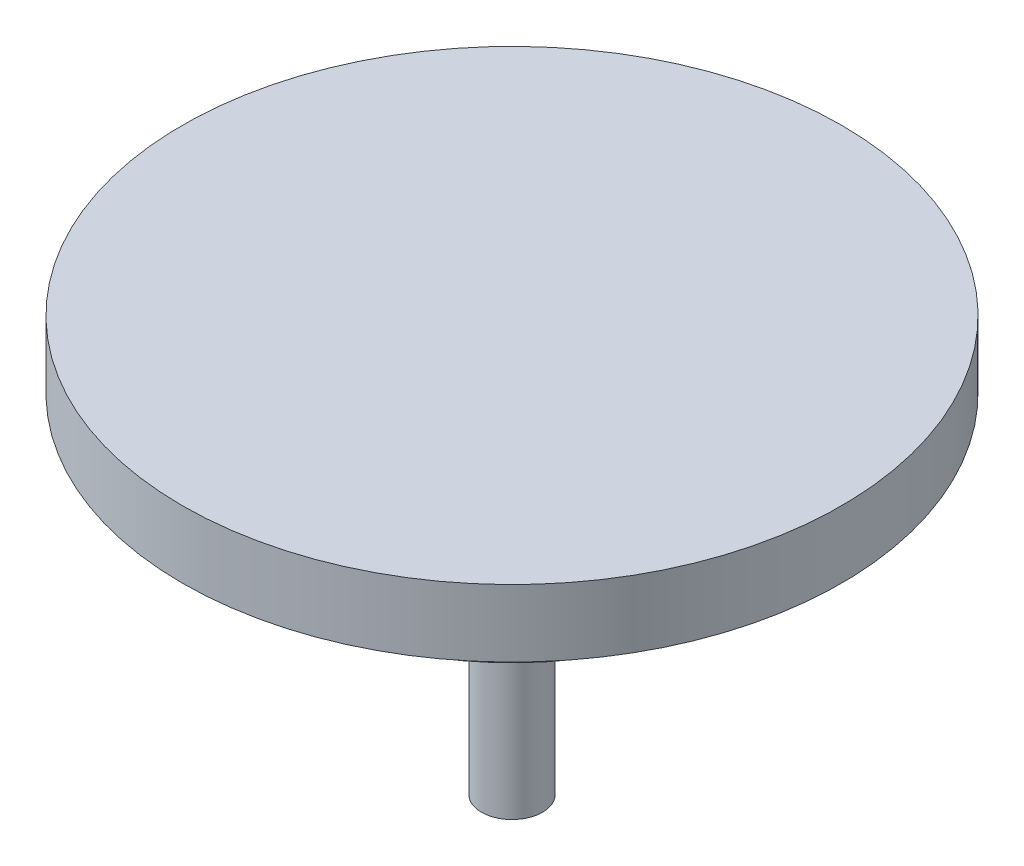
ISO-10303-21;
HEADER;
FILE_DESCRIPTION(('STEP AP214'),'2;1');
FILE_NAME('part.step','',(''),(''),'','','');
FILE_SCHEMA(('AUTOMOTIVE_DESIGN { 1 0 10303 214 1 1 1 1 }'));
ENDSEC;
DATA;
#1=APPLICATION_CONTEXT('core data for automotive mechanical design processes');
#2=APPLICATION_PROTOCOL_DEFINITION('international standard','automotive_design',2000,#1);
#3=PRODUCT_CONTEXT('',#1,'mechanical');
#4=PRODUCT('Part','Part','',(#3));
#5=PRODUCT_RELATED_PRODUCT_CATEGORY('part','',(#4));
#6=PRODUCT_DEFINITION_FORMATION('','',#4);
#7=PRODUCT_DEFINITION_CONTEXT('part definition',#1,'design');
#8=PRODUCT_DEFINITION('design','',#6,#7);
#9=PRODUCT_DEFINITION_SHAPE('','',#8);
#10=(LENGTH_UNIT() NAMED_UNIT(*) SI_UNIT(.MILLI.,.METRE.));
#11=(NAMED_UNIT(*) PLANE_ANGLE_UNIT() SI_UNIT($,.RADIAN.));
#12=(NAMED_UNIT(*) SI_UNIT($,.STERADIAN.) SOLID_ANGLE_UNIT());
#13=UNCERTAINTY_MEASURE_WITH_UNIT(LENGTH_MEASURE(1.E-05),#10,'distance_accuracy_value','');
#14=(GEOMETRIC_REPRESENTATION_CONTEXT(3) GLOBAL_UNCERTAINTY_ASSIGNED_CONTEXT((#13)) GLOBAL_UNIT_ASSIGNED_CONTEXT((#10,
#11,#12)) REPRESENTATION_CONTEXT('',''));
#15=CARTESIAN_POINT('',(0.,0.,0.));
#16=DIRECTION('',(0.,0.,1.));
#17=DIRECTION('',(1.,0.,0.));
#18=AXIS2_PLACEMENT_3D('',#15,#16,#17);
#19=CARTESIAN_POINT('',(0.,11.,0.));
#20=DIRECTION('',(0.,-1.,0.));
#21=DIRECTION('',(0.,0.,-1.));
#22=AXIS2_PLACEMENT_3D('',#19,#20,#21);
#23=CYLINDRICAL_SURFACE('',#22,54.);
#24=CARTESIAN_POINT('',(0.,11.,0.));
#25=DIRECTION('',(0.,1.,0.));
#26=DIRECTION('',(0.,0.,1.));
#27=AXIS2_PLACEMENT_3D('',#24,#25,#26);
#28=CIRCLE('',#27,54.);
#29=CARTESIAN_POINT('',(0.,11.,54.));
#30=VERTEX_POINT('',#29);
#31=EDGE_CURVE('E87',#30,#30,#28,.T.);
#32=ORIENTED_EDGE('',*,*,#31,.F.);
#33=EDGE_LOOP('',(#32));
#34=FACE_BOUND('',#33,.T.);
#35=CARTESIAN_POINT('',(0.,0.,0.));
#36=DIRECTION('',(0.,1.,0.));
#37=DIRECTION('',(0.,0.,1.));
#38=AXIS2_PLACEMENT_3D('',#35,#36,#37);
#39=CIRCLE('',#38,54.);
#40=CARTESIAN_POINT('',(0.,0.,54.));
#41=VERTEX_POINT('',#40);
#42=EDGE_CURVE('E86',#41,#41,#39,.T.);
#43=ORIENTED_EDGE('',*,*,#42,.T.);
#44=EDGE_LOOP('',(#43));
#45=FACE_BOUND('',#44,.T.);
#46=ADVANCED_FACE('F36',(#34,#45),#23,.T.);
#47=CARTESIAN_POINT('',(0.,11.,0.));
#48=DIRECTION('',(0.,1.,0.));
#49=DIRECTION('',(0.,0.,1.));
#50=AXIS2_PLACEMENT_3D('',#47,#48,#49);
#51=PLANE('',#50);
#52=ORIENTED_EDGE('',*,*,#31,.T.);
#53=EDGE_LOOP('',(#52));
#54=FACE_BOUND('',#53,.T.);
#55=ADVANCED_FACE('F108',(#54),#51,.T.);
#56=CARTESIAN_POINT('',(0.,0.,0.));
#57=DIRECTION('',(0.,1.,0.));
#58=DIRECTION('',(0.,0.,1.));
#59=AXIS2_PLACEMENT_3D('',#56,#57,#58);
#60=PLANE('',#59);
#61=CARTESIAN_POINT('',(0.,0.,40.));
#62=CARTESIAN_POINT('',(-4.35909107766324,0.,1.63568879354926));
#63=CARTESIAN_POINT('',(-28.5657137141714,0.,-28.));
#64=B_SPLINE_CURVE_WITH_KNOTS('',2,(#61,#62,#63),.UNSPECIFIED.,.F.,.F.,(3,3),(0.,1.),.UNSPECIFIED.);
#65=CARTESIAN_POINT('',(0.,0.,40.));
#66=VERTEX_POINT('',#65);
#67=CARTESIAN_POINT('',(-28.5657137141714,0.,-28.));
#68=VERTEX_POINT('',#67);
#69=EDGE_CURVE('E64',#66,#68,#64,.T.);
#70=ORIENTED_EDGE('',*,*,#69,.F.);
#71=CARTESIAN_POINT('',(0.,0.,0.));
#72=DIRECTION('',(0.,-1.,0.));
#73=DIRECTION('',(0.,0.,-1.));
#74=AXIS2_PLACEMENT_3D('',#71,#72,#73);
#75=CIRCLE('',#74,40.);
#76=EDGE_CURVE('E51',#68,#66,#75,.T.);
#77=ORIENTED_EDGE('',*,*,#76,.F.);
#78=EDGE_LOOP('',(#70,#77));
#79=FACE_BOUND('',#78,.T.);
#80=CARTESIAN_POINT('',(-46.,0.,19.));
#81=DIRECTION('',(0.,1.,0.));
#82=DIRECTION('',(0.,0.,1.));
#83=AXIS2_PLACEMENT_3D('',#80,#81,#82);
#84=CIRCLE('',#83,4.);
#85=CARTESIAN_POINT('',(-46.,0.,23.));
#86=VERTEX_POINT('',#85);
#87=EDGE_CURVE('E11',#86,#86,#84,.F.);
#88=ORIENTED_EDGE('',*,*,#87,.F.);
#89=EDGE_LOOP('',(#88));
#90=FACE_BOUND('',#89,.T.);
#91=ORIENTED_EDGE('',*,*,#42,.F.);
#92=EDGE_LOOP('',(#91));
#93=FACE_BOUND('',#92,.T.);
#94=ADVANCED_FACE('F65',(#79,#90,#93),#60,.F.);
#95=CARTESIAN_POINT('',(-46.,-10.,19.));
#96=DIRECTION('',(0.,1.,0.));
#97=DIRECTION('',(0.,0.,1.));
#98=AXIS2_PLACEMENT_3D('',#95,#96,#97);
#99=CYLINDRICAL_SURFACE('',#98,4.);
#100=CARTESIAN_POINT('',(-46.,-10.,19.));
#101=DIRECTION('',(0.,-1.,0.));
#102=DIRECTION('',(0.,0.,-1.));
#103=AXIS2_PLACEMENT_3D('',#100,#101,#102);
#104=CIRCLE('',#103,4.);
#105=CARTESIAN_POINT('',(-46.,-10.,15.));
#106=VERTEX_POINT('',#105);
#107=EDGE_CURVE('E83',#106,#106,#104,.T.);
#108=ORIENTED_EDGE('',*,*,#107,.F.);
#109=EDGE_LOOP('',(#108));
#110=FACE_BOUND('',#109,.T.);
#111=ORIENTED_EDGE('',*,*,#87,.T.);
#112=EDGE_LOOP('',(#111));
#113=FACE_BOUND('',#112,.T.);
#114=ADVANCED_FACE('F119',(#110,#113),#99,.T.);
#115=CARTESIAN_POINT('',(-46.,-10.,19.));
#116=DIRECTION('',(0.,-1.,0.));
#117=DIRECTION('',(0.,0.,-1.));
#118=AXIS2_PLACEMENT_3D('',#115,#116,#117);
#119=PLANE('',#118);
#120=ORIENTED_EDGE('',*,*,#107,.T.);
#121=EDGE_LOOP('',(#120));
#122=FACE_BOUND('',#121,.T.);
#123=ADVANCED_FACE('F123',(#122),#119,.T.);
#124=CARTESIAN_POINT('',(0.,-10.,40.));
#125=CARTESIAN_POINT('',(-4.35909107766324,-10.,1.63568879354926));
#126=CARTESIAN_POINT('',(-28.5657137141714,-10.,-28.));
#127=B_SPLINE_CURVE_WITH_KNOTS('',2,(#124,#125,#126),.UNSPECIFIED.,.F.,.F.,(3,3),(0.,1.),.UNSPECIFIED.);
#128=DIRECTION('',(0.,1.,0.));
#129=VECTOR('',#128,1.);
#130=SURFACE_OF_LINEAR_EXTRUSION('',#127,#129);
#131=ORIENTED_EDGE('',*,*,#69,.T.);
#132=DIRECTION('',(0.,1.,0.));
#133=VECTOR('',#132,1.);
#134=CARTESIAN_POINT('',(-28.5657137141714,-10.,-28.));
#135=LINE('',#134,#133);
#136=CARTESIAN_POINT('',(-28.5657137141714,-10.,-28.));
#137=VERTEX_POINT('',#136);
#138=EDGE_CURVE('E75',#137,#68,#135,.T.);
#139=ORIENTED_EDGE('',*,*,#138,.F.);
#140=CARTESIAN_POINT('',(0.,-10.,40.));
#141=VERTEX_POINT('',#140);
#142=EDGE_CURVE('E76',#141,#137,#127,.T.);
#143=ORIENTED_EDGE('',*,*,#142,.F.);
#144=DIRECTION('',(0.,1.,0.));
#145=VECTOR('',#144,1.);
#146=CARTESIAN_POINT('',(0.,-10.,40.));
#147=LINE('',#146,#145);
#148=EDGE_CURVE('E73',#141,#66,#147,.T.);
#149=ORIENTED_EDGE('',*,*,#148,.T.);
#150=EDGE_LOOP('',(#131,#139,#143,#149));
#151=FACE_BOUND('',#150,.T.);
#152=ADVANCED_FACE('F78',(#151),#130,.F.);
#153=CARTESIAN_POINT('',(0.,-10.,0.));
#154=DIRECTION('',(0.,1.,0.));
#155=DIRECTION('',(0.,0.,1.));
#156=AXIS2_PLACEMENT_3D('',#153,#154,#155);
#157=CYLINDRICAL_SURFACE('',#156,40.);
#158=ORIENTED_EDGE('',*,*,#76,.T.);
#159=ORIENTED_EDGE('',*,*,#148,.F.);
#160=CARTESIAN_POINT('',(0.,-10.,0.));
#161=DIRECTION('',(0.,-1.,0.));
#162=DIRECTION('',(0.,0.,-1.));
#163=AXIS2_PLACEMENT_3D('',#160,#161,#162);
#164=CIRCLE('',#163,40.);
#165=EDGE_CURVE('E59',#137,#141,#164,.T.);
#166=ORIENTED_EDGE('',*,*,#165,.F.);
#167=ORIENTED_EDGE('',*,*,#138,.T.);
#168=EDGE_LOOP('',(#158,#159,#166,#167));
#169=FACE_BOUND('',#168,.T.);
#170=ADVANCED_FACE('F72',(#169),#157,.T.);
#171=CARTESIAN_POINT('',(-9.32097396737447,-10.,3.81784439677463));
#172=DIRECTION('',(0.,1.,0.));
#173=DIRECTION('',(0.,0.,1.));
#174=AXIS2_PLACEMENT_3D('',#171,#172,#173);
#175=PLANE('',#174);
#176=CARTESIAN_POINT('',(0.,-10.,0.));
#177=DIRECTION('',(0.,1.,0.));
#178=DIRECTION('',(0.,0.,1.));
#179=AXIS2_PLACEMENT_3D('',#176,#177,#178);
#180=CIRCLE('',#179,5.);
#181=CARTESIAN_POINT('',(0.,-10.,5.));
#182=VERTEX_POINT('',#181);
#183=EDGE_CURVE('E40',#182,#182,#180,.F.);
#184=ORIENTED_EDGE('',*,*,#183,.F.);
#185=EDGE_LOOP('',(#184));
#186=FACE_BOUND('',#185,.T.);
#187=ORIENTED_EDGE('',*,*,#142,.T.);
#188=ORIENTED_EDGE('',*,*,#165,.T.);
#189=EDGE_LOOP('',(#187,#188));
#190=FACE_BOUND('',#189,.T.);
#191=ADVANCED_FACE('F99',(#186,#190),#175,.F.);
#192=CARTESIAN_POINT('',(0.,-57.,0.));
#193=DIRECTION('',(0.,1.,0.));
#194=DIRECTION('',(0.,0.,1.));
#195=AXIS2_PLACEMENT_3D('',#192,#193,#194);
#196=PLANE('',#195);
#197=CARTESIAN_POINT('',(0.,-57.,0.));
#198=DIRECTION('',(0.,1.,0.));
#199=DIRECTION('',(0.,0.,1.));
#200=AXIS2_PLACEMENT_3D('',#197,#198,#199);
#201=CIRCLE('',#200,5.);
#202=CARTESIAN_POINT('',(0.,-57.,5.));
#203=VERTEX_POINT('',#202);
#204=EDGE_CURVE('E45',#203,#203,#201,.T.);
#205=ORIENTED_EDGE('',*,*,#204,.F.);
#206=EDGE_LOOP('',(#205));
#207=FACE_BOUND('',#206,.T.);
#208=ADVANCED_FACE('F97',(#207),#196,.F.);
#209=CARTESIAN_POINT('',(0.,-57.,0.));
#210=DIRECTION('',(0.,1.,0.));
#211=DIRECTION('',(0.,0.,1.));
#212=AXIS2_PLACEMENT_3D('',#209,#210,#211);
#213=CYLINDRICAL_SURFACE('',#212,5.);
#214=CARTESIAN_POINT('',(0.,-57.,5.));
#215=CARTESIAN_POINT('',(0.,-56.5104166666667,5.));
#216=CARTESIAN_POINT('',(0.,-56.0208333333333,5.));
#217=CARTESIAN_POINT('',(0.,-55.0416666666667,5.));
#218=CARTESIAN_POINT('',(0.,-54.5520833333333,5.));
#219=CARTESIAN_POINT('',(0.,-53.5729166666667,5.));
#220=CARTESIAN_POINT('',(0.,-53.0833333333333,5.));
#221=CARTESIAN_POINT('',(0.,-52.1041666666667,5.));
#222=CARTESIAN_POINT('',(0.,-51.6145833333333,5.));
#223=CARTESIAN_POINT('',(0.,-50.6354166666667,5.));
#224=CARTESIAN_POINT('',(0.,-50.1458333333333,5.));
#225=CARTESIAN_POINT('',(0.,-49.1666666666667,5.));
#226=CARTESIAN_POINT('',(0.,-48.6770833333333,5.));
#227=CARTESIAN_POINT('',(0.,-47.6979166666667,5.));
#228=CARTESIAN_POINT('',(0.,-47.2083333333333,5.));
#229=CARTESIAN_POINT('',(0.,-46.2291666666667,5.));
#230=CARTESIAN_POINT('',(0.,-45.7395833333333,5.));
#231=CARTESIAN_POINT('',(0.,-44.7604166666667,5.));
#232=CARTESIAN_POINT('',(0.,-44.2708333333333,5.));
#233=CARTESIAN_POINT('',(0.,-43.2916666666667,5.));
#234=CARTESIAN_POINT('',(0.,-42.8020833333333,5.));
#235=CARTESIAN_POINT('',(0.,-41.8229166666667,5.));
#236=CARTESIAN_POINT('',(0.,-41.3333333333333,5.));
#237=CARTESIAN_POINT('',(0.,-40.3541666666667,5.));
#238=CARTESIAN_POINT('',(0.,-39.8645833333333,5.));
#239=CARTESIAN_POINT('',(0.,-38.8854166666667,5.));
#240=CARTESIAN_POINT('',(0.,-38.3958333333333,5.));
#241=CARTESIAN_POINT('',(0.,-37.4166666666667,5.));
#242=CARTESIAN_POINT('',(0.,-36.9270833333333,5.));
#243=CARTESIAN_POINT('',(0.,-35.9479166666667,5.));
#244=CARTESIAN_POINT('',(0.,-35.4583333333333,5.));
#245=CARTESIAN_POINT('',(0.,-34.4791666666667,5.));
#246=CARTESIAN_POINT('',(0.,-33.9895833333333,5.));
#247=CARTESIAN_POINT('',(0.,-33.0104166666667,5.));
#248=CARTESIAN_POINT('',(0.,-32.5208333333333,5.));
#249=CARTESIAN_POINT('',(0.,-31.5416666666667,5.));
#250=CARTESIAN_POINT('',(0.,-31.0520833333333,5.));
#251=CARTESIAN_POINT('',(0.,-30.0729166666667,5.));
#252=CARTESIAN_POINT('',(0.,-29.5833333333333,5.));
#253=CARTESIAN_POINT('',(0.,-28.6041666666667,5.));
#254=CARTESIAN_POINT('',(0.,-28.1145833333333,5.));
#255=CARTESIAN_POINT('',(0.,-27.1354166666667,5.));
#256=CARTESIAN_POINT('',(0.,-26.6458333333333,5.));
#257=CARTESIAN_POINT('',(0.,-25.6666666666667,5.));
#258=CARTESIAN_POINT('',(0.,-25.1770833333333,5.));
#259=CARTESIAN_POINT('',(0.,-24.1979166666667,5.));
#260=CARTESIAN_POINT('',(0.,-23.7083333333333,5.));
#261=CARTESIAN_POINT('',(0.,-22.7291666666667,5.));
#262=CARTESIAN_POINT('',(0.,-22.2395833333333,5.));
#263=CARTESIAN_POINT('',(0.,-21.2604166666667,5.));
#264=CARTESIAN_POINT('',(0.,-20.7708333333333,5.));
#265=CARTESIAN_POINT('',(0.,-19.7916666666667,5.));
#266=CARTESIAN_POINT('',(0.,-19.3020833333333,5.));
#267=CARTESIAN_POINT('',(0.,-18.3229166666667,5.));
#268=CARTESIAN_POINT('',(0.,-17.8333333333333,5.));
#269=CARTESIAN_POINT('',(0.,-16.8541666666667,5.));
#270=CARTESIAN_POINT('',(0.,-16.3645833333333,5.));
#271=CARTESIAN_POINT('',(0.,-15.3854166666667,5.));
#272=CARTESIAN_POINT('',(0.,-14.8958333333333,5.));
#273=CARTESIAN_POINT('',(0.,-13.9166666666667,5.));
#274=CARTESIAN_POINT('',(0.,-13.4270833333333,5.));
#275=CARTESIAN_POINT('',(0.,-12.4479166666667,5.));
#276=CARTESIAN_POINT('',(0.,-11.9583333333333,5.));
#277=CARTESIAN_POINT('',(0.,-10.9791666666667,5.));
#278=CARTESIAN_POINT('',(0.,-10.4895833333333,5.));
#279=CARTESIAN_POINT('',(0.,-10.,5.));
#280=B_SPLINE_CURVE_WITH_KNOTS('',3,(#214,#215,#216,#217,#218,#219,#220,#221,#222,#223,#224,
#225,#226,#227,#228,#229,#230,#231,#232,#233,#234,#235,#236,#237,#238,#239,#240,#241,#242,#243,
#244,#245,#246,#247,#248,#249,#250,#251,#252,#253,#254,#255,#256,#257,#258,#259,#260,#261,#262,
#263,#264,#265,#266,#267,#268,#269,#270,#271,#272,#273,#274,#275,#276,#277,#278,#279),
.UNSPECIFIED.,.F.,.F.,(4,2,2,2,2,2,2,2,2,2,2,2,2,2,2,2,2,2,2,2,2,2,2,2,2,2,2,2,2,2,2,2,4),(0.,
1.46875,2.9375,4.40624999999999,5.875,7.34375,8.81249999999999,10.28125,11.75,13.21875,14.6875,
16.15625,17.625,19.09375,20.5625,22.03125,23.5,24.96875,26.4375,27.90625,29.375,30.84375,
32.3125,33.78125,35.25,36.71875,38.1875,39.65625,41.125,42.59375,44.0625,45.53125,47.),.UNSPECIFIED.);
#281=EDGE_CURVE('BSEAM38',#203,#182,#280,.T.);
#282=ORIENTED_EDGE('',*,*,#204,.T.);
#283=ORIENTED_EDGE('',*,*,#183,.T.);
#284=ORIENTED_EDGE('',*,*,#281,.T.);
#285=ORIENTED_EDGE('',*,*,#281,.F.);
#286=EDGE_LOOP('',(#282,#284,#283,#285));
#287=FACE_BOUND('',#286,.T.);
#288=ADVANCED_FACE('F38',(#287),#213,.T.);
#289=CLOSED_SHELL('',(#46,#55,#94,#114,#123,#152,#170,#191,#208,#288));
#290=MANIFOLD_SOLID_BREP('B2',#289);
#291=ADVANCED_BREP_SHAPE_REPRESENTATION('',(#18,#290),#14);
#292=SHAPE_DEFINITION_REPRESENTATION(#9,#291);
ENDSEC;
END-ISO-10303-21;
